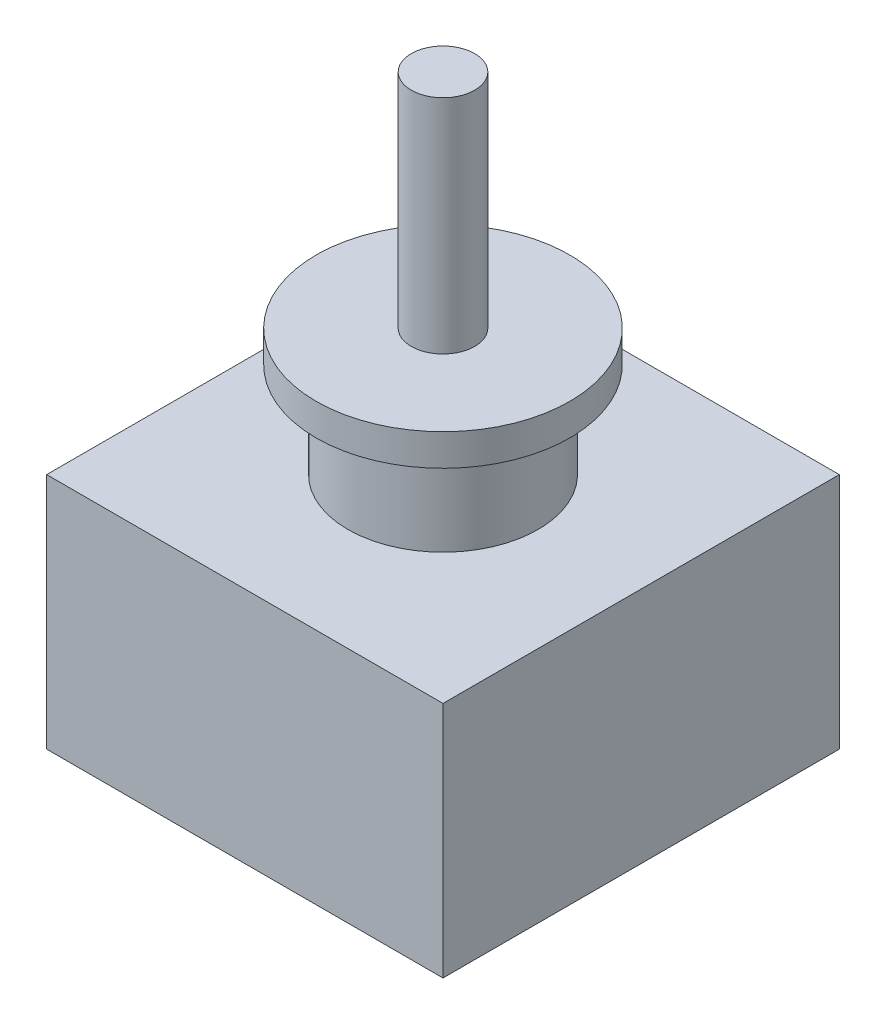
ISO-10303-21;
HEADER;
FILE_DESCRIPTION(('STEP AP214'),'2;1');
FILE_NAME('part.step','',(''),(''),'','','');
FILE_SCHEMA(('AUTOMOTIVE_DESIGN { 1 0 10303 214 1 1 1 1 }'));
ENDSEC;
DATA;
#1=APPLICATION_CONTEXT('core data for automotive mechanical design processes');
#2=APPLICATION_PROTOCOL_DEFINITION('international standard','automotive_design',2000,#1);
#3=PRODUCT_CONTEXT('',#1,'mechanical');
#4=PRODUCT('Part','Part','',(#3));
#5=PRODUCT_RELATED_PRODUCT_CATEGORY('part','',(#4));
#6=PRODUCT_DEFINITION_FORMATION('','',#4);
#7=PRODUCT_DEFINITION_CONTEXT('part definition',#1,'design');
#8=PRODUCT_DEFINITION('design','',#6,#7);
#9=PRODUCT_DEFINITION_SHAPE('','',#8);
#10=(LENGTH_UNIT() NAMED_UNIT(*) SI_UNIT(.MILLI.,.METRE.));
#11=(NAMED_UNIT(*) PLANE_ANGLE_UNIT() SI_UNIT($,.RADIAN.));
#12=(NAMED_UNIT(*) SI_UNIT($,.STERADIAN.) SOLID_ANGLE_UNIT());
#13=UNCERTAINTY_MEASURE_WITH_UNIT(LENGTH_MEASURE(1.E-05),#10,'distance_accuracy_value','');
#14=(GEOMETRIC_REPRESENTATION_CONTEXT(3) GLOBAL_UNCERTAINTY_ASSIGNED_CONTEXT((#13)) GLOBAL_UNIT_ASSIGNED_CONTEXT((#10,
#11,#12)) REPRESENTATION_CONTEXT('',''));
#15=CARTESIAN_POINT('',(0.,0.,0.));
#16=DIRECTION('',(0.,0.,1.));
#17=DIRECTION('',(1.,0.,0.));
#18=AXIS2_PLACEMENT_3D('',#15,#16,#17);
#19=CARTESIAN_POINT('',(0.,23.,0.));
#20=DIRECTION('',(0.,1.,0.));
#21=DIRECTION('',(0.,0.,1.));
#22=AXIS2_PLACEMENT_3D('',#19,#20,#21);
#23=PLANE('',#22);
#24=CARTESIAN_POINT('',(0.,23.,0.));
#25=DIRECTION('',(0.,1.,0.));
#26=DIRECTION('',(0.,0.,1.));
#27=AXIS2_PLACEMENT_3D('',#24,#25,#26);
#28=CIRCLE('',#27,8.);
#29=CARTESIAN_POINT('',(0.,23.,8.));
#30=VERTEX_POINT('',#29);
#31=EDGE_CURVE('E149',#30,#30,#28,.T.);
#32=ORIENTED_EDGE('',*,*,#31,.T.);
#33=EDGE_LOOP('',(#32));
#34=FACE_BOUND('',#33,.T.);
#35=CARTESIAN_POINT('',(0.,23.,0.));
#36=DIRECTION('',(0.,1.,0.));
#37=DIRECTION('',(0.,0.,1.));
#38=AXIS2_PLACEMENT_3D('',#35,#36,#37);
#39=CIRCLE('',#38,2.);
#40=CARTESIAN_POINT('',(0.,23.,2.));
#41=VERTEX_POINT('',#40);
#42=EDGE_CURVE('E157',#41,#41,#39,.T.);
#43=ORIENTED_EDGE('',*,*,#42,.F.);
#44=EDGE_LOOP('',(#43));
#45=FACE_BOUND('',#44,.T.);
#46=ADVANCED_FACE('F31',(#34,#45),#23,.T.);
#47=CARTESIAN_POINT('',(-12.5,15.,-12.5));
#48=DIRECTION('',(0.,-1.,0.));
#49=DIRECTION('',(0.,0.,-1.));
#50=AXIS2_PLACEMENT_3D('',#47,#48,#49);
#51=PLANE('',#50);
#52=DIRECTION('',(0.,0.,1.));
#53=VECTOR('',#52,1.);
#54=CARTESIAN_POINT('',(-12.5,15.,12.5));
#55=LINE('',#54,#53);
#56=CARTESIAN_POINT('',(-12.5,15.,-12.5));
#57=VERTEX_POINT('',#56);
#58=CARTESIAN_POINT('',(-12.5,15.,12.5));
#59=VERTEX_POINT('',#58);
#60=EDGE_CURVE('E85',#57,#59,#55,.T.);
#61=ORIENTED_EDGE('',*,*,#60,.T.);
#62=DIRECTION('',(1.,0.,0.));
#63=VECTOR('',#62,1.);
#64=CARTESIAN_POINT('',(-12.5,15.,12.5));
#65=LINE('',#64,#63);
#66=CARTESIAN_POINT('',(12.5,15.,12.5));
#67=VERTEX_POINT('',#66);
#68=EDGE_CURVE('E79',#59,#67,#65,.T.);
#69=ORIENTED_EDGE('',*,*,#68,.T.);
#70=DIRECTION('',(0.,0.,-1.));
#71=VECTOR('',#70,1.);
#72=CARTESIAN_POINT('',(12.5,15.,12.5));
#73=LINE('',#72,#71);
#74=CARTESIAN_POINT('',(12.5,15.,-12.5));
#75=VERTEX_POINT('',#74);
#76=EDGE_CURVE('E83',#67,#75,#73,.T.);
#77=ORIENTED_EDGE('',*,*,#76,.T.);
#78=DIRECTION('',(-1.,0.,0.));
#79=VECTOR('',#78,1.);
#80=CARTESIAN_POINT('',(-12.5,15.,-12.5));
#81=LINE('',#80,#79);
#82=EDGE_CURVE('E48',#75,#57,#81,.T.);
#83=ORIENTED_EDGE('',*,*,#82,.T.);
#84=EDGE_LOOP('',(#61,#69,#77,#83));
#85=FACE_BOUND('',#84,.T.);
#86=CARTESIAN_POINT('',(0.,15.,0.));
#87=DIRECTION('',(0.,-1.,0.));
#88=DIRECTION('',(0.,0.,-1.));
#89=AXIS2_PLACEMENT_3D('',#86,#87,#88);
#90=CIRCLE('',#89,6.);
#91=CARTESIAN_POINT('',(0.,15.,-6.));
#92=VERTEX_POINT('',#91);
#93=EDGE_CURVE('E11',#92,#92,#90,.F.);
#94=ORIENTED_EDGE('',*,*,#93,.F.);
#95=EDGE_LOOP('',(#94));
#96=FACE_BOUND('',#95,.T.);
#97=ADVANCED_FACE('F80',(#85,#96),#51,.F.);
#98=CARTESIAN_POINT('',(-12.5,15.,12.5));
#99=DIRECTION('',(1.,0.,0.));
#100=DIRECTION('',(0.,0.,-1.));
#101=AXIS2_PLACEMENT_3D('',#98,#99,#100);
#102=PLANE('',#101);
#103=DIRECTION('',(0.,0.,1.));
#104=VECTOR('',#103,1.);
#105=CARTESIAN_POINT('',(-12.5,0.,12.5));
#106=LINE('',#105,#104);
#107=CARTESIAN_POINT('',(-12.5,0.,-12.5));
#108=VERTEX_POINT('',#107);
#109=CARTESIAN_POINT('',(-12.5,0.,12.5));
#110=VERTEX_POINT('',#109);
#111=EDGE_CURVE('E99',#108,#110,#106,.T.);
#112=ORIENTED_EDGE('',*,*,#111,.T.);
#113=DIRECTION('',(0.,-1.,0.));
#114=VECTOR('',#113,1.);
#115=CARTESIAN_POINT('',(-12.5,15.,12.5));
#116=LINE('',#115,#114);
#117=EDGE_CURVE('E40',#59,#110,#116,.T.);
#118=ORIENTED_EDGE('',*,*,#117,.F.);
#119=ORIENTED_EDGE('',*,*,#60,.F.);
#120=DIRECTION('',(0.,-1.,0.));
#121=VECTOR('',#120,1.);
#122=CARTESIAN_POINT('',(-12.5,15.,-12.5));
#123=LINE('',#122,#121);
#124=EDGE_CURVE('E95',#57,#108,#123,.T.);
#125=ORIENTED_EDGE('',*,*,#124,.T.);
#126=EDGE_LOOP('',(#112,#118,#119,#125));
#127=FACE_BOUND('',#126,.T.);
#128=ADVANCED_FACE('F33',(#127),#102,.F.);
#129=CARTESIAN_POINT('',(-12.5,15.,12.5));
#130=DIRECTION('',(0.,0.,-1.));
#131=DIRECTION('',(-1.,0.,0.));
#132=AXIS2_PLACEMENT_3D('',#129,#130,#131);
#133=PLANE('',#132);
#134=DIRECTION('',(1.,0.,0.));
#135=VECTOR('',#134,1.);
#136=CARTESIAN_POINT('',(-12.5,0.,12.5));
#137=LINE('',#136,#135);
#138=CARTESIAN_POINT('',(12.5,0.,12.5));
#139=VERTEX_POINT('',#138);
#140=EDGE_CURVE('E90',#110,#139,#137,.T.);
#141=ORIENTED_EDGE('',*,*,#140,.T.);
#142=DIRECTION('',(0.,-1.,0.));
#143=VECTOR('',#142,1.);
#144=CARTESIAN_POINT('',(12.5,15.,12.5));
#145=LINE('',#144,#143);
#146=EDGE_CURVE('E88',#67,#139,#145,.T.);
#147=ORIENTED_EDGE('',*,*,#146,.F.);
#148=ORIENTED_EDGE('',*,*,#68,.F.);
#149=ORIENTED_EDGE('',*,*,#117,.T.);
#150=EDGE_LOOP('',(#141,#147,#148,#149));
#151=FACE_BOUND('',#150,.T.);
#152=ADVANCED_FACE('F89',(#151),#133,.F.);
#153=CARTESIAN_POINT('',(12.5,15.,12.5));
#154=DIRECTION('',(-1.,0.,0.));
#155=DIRECTION('',(0.,0.,1.));
#156=AXIS2_PLACEMENT_3D('',#153,#154,#155);
#157=PLANE('',#156);
#158=DIRECTION('',(0.,0.,-1.));
#159=VECTOR('',#158,1.);
#160=CARTESIAN_POINT('',(12.5,0.,12.5));
#161=LINE('',#160,#159);
#162=CARTESIAN_POINT('',(12.5,0.,-12.5));
#163=VERTEX_POINT('',#162);
#164=EDGE_CURVE('E65',#139,#163,#161,.T.);
#165=ORIENTED_EDGE('',*,*,#164,.T.);
#166=DIRECTION('',(0.,-1.,0.));
#167=VECTOR('',#166,1.);
#168=CARTESIAN_POINT('',(12.5,15.,-12.5));
#169=LINE('',#168,#167);
#170=EDGE_CURVE('E91',#75,#163,#169,.T.);
#171=ORIENTED_EDGE('',*,*,#170,.F.);
#172=ORIENTED_EDGE('',*,*,#76,.F.);
#173=ORIENTED_EDGE('',*,*,#146,.T.);
#174=EDGE_LOOP('',(#165,#171,#172,#173));
#175=FACE_BOUND('',#174,.T.);
#176=ADVANCED_FACE('F93',(#175),#157,.F.);
#177=CARTESIAN_POINT('',(-12.5,15.,-12.5));
#178=DIRECTION('',(0.,0.,1.));
#179=DIRECTION('',(1.,0.,0.));
#180=AXIS2_PLACEMENT_3D('',#177,#178,#179);
#181=PLANE('',#180);
#182=DIRECTION('',(-1.,0.,0.));
#183=VECTOR('',#182,1.);
#184=CARTESIAN_POINT('',(-12.5,0.,-12.5));
#185=LINE('',#184,#183);
#186=EDGE_CURVE('E71',#163,#108,#185,.T.);
#187=ORIENTED_EDGE('',*,*,#186,.T.);
#188=ORIENTED_EDGE('',*,*,#124,.F.);
#189=ORIENTED_EDGE('',*,*,#82,.F.);
#190=ORIENTED_EDGE('',*,*,#170,.T.);
#191=EDGE_LOOP('',(#187,#188,#189,#190));
#192=FACE_BOUND('',#191,.T.);
#193=ADVANCED_FACE('F113',(#192),#181,.F.);
#194=CARTESIAN_POINT('',(-12.5,0.,-12.5));
#195=DIRECTION('',(0.,-1.,0.));
#196=DIRECTION('',(0.,0.,-1.));
#197=AXIS2_PLACEMENT_3D('',#194,#195,#196);
#198=PLANE('',#197);
#199=ORIENTED_EDGE('',*,*,#111,.F.);
#200=ORIENTED_EDGE('',*,*,#186,.F.);
#201=ORIENTED_EDGE('',*,*,#164,.F.);
#202=ORIENTED_EDGE('',*,*,#140,.F.);
#203=EDGE_LOOP('',(#199,#200,#201,#202));
#204=FACE_BOUND('',#203,.T.);
#205=ADVANCED_FACE('F110',(#204),#198,.T.);
#206=CARTESIAN_POINT('',(0.,21.,0.));
#207=DIRECTION('',(0.,-1.,0.));
#208=DIRECTION('',(0.,0.,-1.));
#209=AXIS2_PLACEMENT_3D('',#206,#207,#208);
#210=CYLINDRICAL_SURFACE('',#209,6.);
#211=CARTESIAN_POINT('',(0.,21.,0.));
#212=DIRECTION('',(0.,1.,0.));
#213=DIRECTION('',(0.,0.,1.));
#214=AXIS2_PLACEMENT_3D('',#211,#212,#213);
#215=CIRCLE('',#214,6.);
#216=CARTESIAN_POINT('',(0.,21.,6.));
#217=VERTEX_POINT('',#216);
#218=EDGE_CURVE('E102',#217,#217,#215,.T.);
#219=ORIENTED_EDGE('',*,*,#218,.F.);
#220=EDGE_LOOP('',(#219));
#221=FACE_BOUND('',#220,.T.);
#222=ORIENTED_EDGE('',*,*,#93,.T.);
#223=EDGE_LOOP('',(#222));
#224=FACE_BOUND('',#223,.T.);
#225=ADVANCED_FACE('F112',(#221,#224),#210,.T.);
#226=CARTESIAN_POINT('',(0.,21.,0.));
#227=DIRECTION('',(0.,1.,0.));
#228=DIRECTION('',(0.,0.,1.));
#229=AXIS2_PLACEMENT_3D('',#226,#227,#228);
#230=PLANE('',#229);
#231=CARTESIAN_POINT('',(0.,21.,0.));
#232=DIRECTION('',(0.,1.,0.));
#233=DIRECTION('',(0.,0.,1.));
#234=AXIS2_PLACEMENT_3D('',#231,#232,#233);
#235=CIRCLE('',#234,8.);
#236=CARTESIAN_POINT('',(0.,21.,8.));
#237=VERTEX_POINT('',#236);
#238=EDGE_CURVE('E152',#237,#237,#235,.T.);
#239=ORIENTED_EDGE('',*,*,#238,.F.);
#240=EDGE_LOOP('',(#239));
#241=FACE_BOUND('',#240,.T.);
#242=ORIENTED_EDGE('',*,*,#218,.T.);
#243=EDGE_LOOP('',(#242));
#244=FACE_BOUND('',#243,.T.);
#245=ADVANCED_FACE('F119',(#241,#244),#230,.F.);
#246=CARTESIAN_POINT('',(0.,23.,0.));
#247=DIRECTION('',(0.,-1.,0.));
#248=DIRECTION('',(0.,0.,-1.));
#249=AXIS2_PLACEMENT_3D('',#246,#247,#248);
#250=CYLINDRICAL_SURFACE('',#249,8.);
#251=ORIENTED_EDGE('',*,*,#31,.F.);
#252=EDGE_LOOP('',(#251));
#253=FACE_BOUND('',#252,.T.);
#254=ORIENTED_EDGE('',*,*,#238,.T.);
#255=EDGE_LOOP('',(#254));
#256=FACE_BOUND('',#255,.T.);
#257=ADVANCED_FACE('F138',(#253,#256),#250,.T.);
#258=CARTESIAN_POINT('',(0.,37.,0.));
#259=DIRECTION('',(0.,-1.,0.));
#260=DIRECTION('',(0.,0.,-1.));
#261=AXIS2_PLACEMENT_3D('',#258,#259,#260);
#262=CYLINDRICAL_SURFACE('',#261,2.);
#263=CARTESIAN_POINT('',(0.,37.,0.));
#264=DIRECTION('',(0.,1.,0.));
#265=DIRECTION('',(0.,0.,1.));
#266=AXIS2_PLACEMENT_3D('',#263,#264,#265);
#267=CIRCLE('',#266,2.);
#268=CARTESIAN_POINT('',(0.,37.,2.));
#269=VERTEX_POINT('',#268);
#270=EDGE_CURVE('E153',#269,#269,#267,.T.);
#271=ORIENTED_EDGE('',*,*,#270,.F.);
#272=EDGE_LOOP('',(#271));
#273=FACE_BOUND('',#272,.T.);
#274=ORIENTED_EDGE('',*,*,#42,.T.);
#275=EDGE_LOOP('',(#274));
#276=FACE_BOUND('',#275,.T.);
#277=ADVANCED_FACE('F134',(#273,#276),#262,.T.);
#278=CARTESIAN_POINT('',(0.,37.,0.));
#279=DIRECTION('',(0.,1.,0.));
#280=DIRECTION('',(0.,0.,1.));
#281=AXIS2_PLACEMENT_3D('',#278,#279,#280);
#282=PLANE('',#281);
#283=ORIENTED_EDGE('',*,*,#270,.T.);
#284=EDGE_LOOP('',(#283));
#285=FACE_BOUND('',#284,.T.);
#286=ADVANCED_FACE('F145',(#285),#282,.T.);
#287=CLOSED_SHELL('',(#46,#97,#128,#152,#176,#193,#205,#225,#245,#257,#277,#286));
#288=MANIFOLD_SOLID_BREP('B2',#287);
#289=ADVANCED_BREP_SHAPE_REPRESENTATION('',(#18,#288),#14);
#290=SHAPE_DEFINITION_REPRESENTATION(#9,#289);
ENDSEC;
END-ISO-10303-21;
